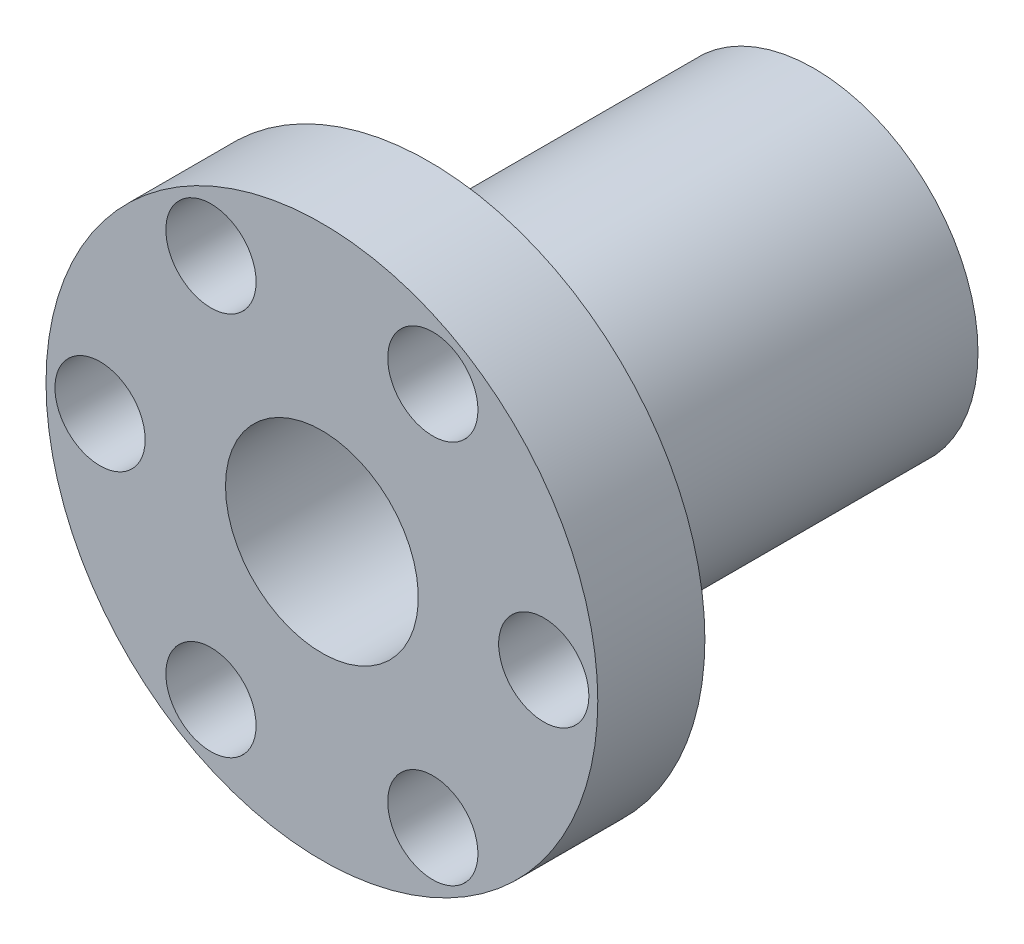
ISO-10303-21;
HEADER;
FILE_DESCRIPTION(('STEP AP214'),'2;1');
FILE_NAME('part.step','',(''),(''),'','','');
FILE_SCHEMA(('AUTOMOTIVE_DESIGN { 1 0 10303 214 1 1 1 1 }'));
ENDSEC;
DATA;
#1=APPLICATION_CONTEXT('core data for automotive mechanical design processes');
#2=APPLICATION_PROTOCOL_DEFINITION('international standard','automotive_design',2000,#1);
#3=PRODUCT_CONTEXT('',#1,'mechanical');
#4=PRODUCT('Part','Part','',(#3));
#5=PRODUCT_RELATED_PRODUCT_CATEGORY('part','',(#4));
#6=PRODUCT_DEFINITION_FORMATION('','',#4);
#7=PRODUCT_DEFINITION_CONTEXT('part definition',#1,'design');
#8=PRODUCT_DEFINITION('design','',#6,#7);
#9=PRODUCT_DEFINITION_SHAPE('','',#8);
#10=(LENGTH_UNIT() NAMED_UNIT(*) SI_UNIT(.MILLI.,.METRE.));
#11=(NAMED_UNIT(*) PLANE_ANGLE_UNIT() SI_UNIT($,.RADIAN.));
#12=(NAMED_UNIT(*) SI_UNIT($,.STERADIAN.) SOLID_ANGLE_UNIT());
#13=UNCERTAINTY_MEASURE_WITH_UNIT(LENGTH_MEASURE(1.E-05),#10,'distance_accuracy_value','');
#14=(GEOMETRIC_REPRESENTATION_CONTEXT(3) GLOBAL_UNCERTAINTY_ASSIGNED_CONTEXT((#13)) GLOBAL_UNIT_ASSIGNED_CONTEXT((#10,
#11,#12)) REPRESENTATION_CONTEXT('',''));
#15=CARTESIAN_POINT('',(0.,0.,0.));
#16=DIRECTION('',(0.,0.,1.));
#17=DIRECTION('',(1.,0.,0.));
#18=AXIS2_PLACEMENT_3D('',#15,#16,#17);
#19=CARTESIAN_POINT('',(0.,0.,11.11));
#20=DIRECTION('',(0.,0.,1.));
#21=DIRECTION('',(1.,0.,0.));
#22=AXIS2_PLACEMENT_3D('',#19,#20,#21);
#23=PLANE('',#22);
#24=CARTESIAN_POINT('',(-11.5075,19.9315746680988,11.11));
#25=DIRECTION('',(0.,0.,1.));
#26=DIRECTION('',(1.,0.,0.));
#27=AXIS2_PLACEMENT_3D('',#24,#25,#26);
#28=CIRCLE('',#27,4.68);
#29=CARTESIAN_POINT('',(-6.82750000000001,19.9315746680988,11.11));
#30=VERTEX_POINT('',#29);
#31=EDGE_CURVE('E70',#30,#30,#28,.T.);
#32=ORIENTED_EDGE('',*,*,#31,.F.);
#33=EDGE_LOOP('',(#32));
#34=FACE_BOUND('',#33,.T.);
#35=CARTESIAN_POINT('',(-11.5075,-19.9315746680989,11.11));
#36=DIRECTION('',(0.,0.,1.));
#37=DIRECTION('',(1.,0.,0.));
#38=AXIS2_PLACEMENT_3D('',#35,#36,#37);
#39=CIRCLE('',#38,4.68);
#40=CARTESIAN_POINT('',(-6.82749999999999,-19.9315746680989,11.11));
#41=VERTEX_POINT('',#40);
#42=EDGE_CURVE('E62',#41,#41,#39,.T.);
#43=ORIENTED_EDGE('',*,*,#42,.F.);
#44=EDGE_LOOP('',(#43));
#45=FACE_BOUND('',#44,.T.);
#46=CARTESIAN_POINT('',(23.015,0.,11.11));
#47=DIRECTION('',(0.,0.,1.));
#48=DIRECTION('',(1.,0.,0.));
#49=AXIS2_PLACEMENT_3D('',#46,#47,#48);
#50=CIRCLE('',#49,4.68);
#51=CARTESIAN_POINT('',(27.695,0.,11.11));
#52=VERTEX_POINT('',#51);
#53=EDGE_CURVE('E52',#52,#52,#50,.T.);
#54=ORIENTED_EDGE('',*,*,#53,.F.);
#55=EDGE_LOOP('',(#54));
#56=FACE_BOUND('',#55,.T.);
#57=CARTESIAN_POINT('',(0.,0.,11.11));
#58=DIRECTION('',(0.,0.,-1.));
#59=DIRECTION('',(-1.,0.,0.));
#60=AXIS2_PLACEMENT_3D('',#57,#58,#59);
#61=CIRCLE('',#60,10.);
#62=CARTESIAN_POINT('',(-10.,0.,11.11));
#63=VERTEX_POINT('',#62);
#64=EDGE_CURVE('E118',#63,#63,#61,.T.);
#65=ORIENTED_EDGE('',*,*,#64,.T.);
#66=EDGE_LOOP('',(#65));
#67=FACE_BOUND('',#66,.T.);
#68=CARTESIAN_POINT('',(0.,0.,11.11));
#69=DIRECTION('',(0.,0.,1.));
#70=DIRECTION('',(1.,0.,0.));
#71=AXIS2_PLACEMENT_3D('',#68,#69,#70);
#72=CIRCLE('',#71,28.62);
#73=CARTESIAN_POINT('',(28.62,0.,11.11));
#74=VERTEX_POINT('',#73);
#75=EDGE_CURVE('E39',#74,#74,#72,.T.);
#76=ORIENTED_EDGE('',*,*,#75,.T.);
#77=EDGE_LOOP('',(#76));
#78=FACE_BOUND('',#77,.T.);
#79=CARTESIAN_POINT('',(11.5075,-19.9315746680989,11.11));
#80=DIRECTION('',(0.,0.,1.));
#81=DIRECTION('',(1.,0.,0.));
#82=AXIS2_PLACEMENT_3D('',#79,#80,#81);
#83=CIRCLE('',#82,4.68);
#84=CARTESIAN_POINT('',(16.1875,-19.9315746680989,11.11));
#85=VERTEX_POINT('',#84);
#86=EDGE_CURVE('E57',#85,#85,#83,.T.);
#87=ORIENTED_EDGE('',*,*,#86,.F.);
#88=EDGE_LOOP('',(#87));
#89=FACE_BOUND('',#88,.T.);
#90=CARTESIAN_POINT('',(-23.015,0.,11.11));
#91=DIRECTION('',(0.,0.,1.));
#92=DIRECTION('',(1.,0.,0.));
#93=AXIS2_PLACEMENT_3D('',#90,#91,#92);
#94=CIRCLE('',#93,4.68);
#95=CARTESIAN_POINT('',(-18.335,0.,11.11));
#96=VERTEX_POINT('',#95);
#97=EDGE_CURVE('E66',#96,#96,#94,.T.);
#98=ORIENTED_EDGE('',*,*,#97,.F.);
#99=EDGE_LOOP('',(#98));
#100=FACE_BOUND('',#99,.T.);
#101=CARTESIAN_POINT('',(11.5075,19.9315746680989,11.11));
#102=DIRECTION('',(0.,0.,1.));
#103=DIRECTION('',(1.,0.,0.));
#104=AXIS2_PLACEMENT_3D('',#101,#102,#103);
#105=CIRCLE('',#104,4.68);
#106=CARTESIAN_POINT('',(16.1875,19.9315746680989,11.11));
#107=VERTEX_POINT('',#106);
#108=EDGE_CURVE('E238',#107,#107,#105,.T.);
#109=ORIENTED_EDGE('',*,*,#108,.F.);
#110=EDGE_LOOP('',(#109));
#111=FACE_BOUND('',#110,.T.);
#112=ADVANCED_FACE('F31',(#34,#45,#56,#67,#78,#89,#100,#111),#23,.T.);
#113=CARTESIAN_POINT('',(11.5075000000002,19.9315746680987,-7.77817459305202));
#114=DIRECTION('',(0.,0.,1.));
#115=DIRECTION('',(1.,0.,0.));
#116=AXIS2_PLACEMENT_3D('',#113,#114,#115);
#117=CYLINDRICAL_SURFACE('',#116,2.75);
#118=CARTESIAN_POINT('',(11.5075000000002,19.9315746680987,0.));
#119=DIRECTION('',(0.,0.,1.));
#120=DIRECTION('',(1.,0.,0.));
#121=AXIS2_PLACEMENT_3D('',#118,#119,#120);
#122=CIRCLE('',#121,2.75);
#123=CARTESIAN_POINT('',(14.2575000000002,19.9315746680987,0.));
#124=VERTEX_POINT('',#123);
#125=EDGE_CURVE('E51',#124,#124,#122,.F.);
#126=ORIENTED_EDGE('',*,*,#125,.T.);
#127=EDGE_LOOP('',(#126));
#128=FACE_BOUND('',#127,.T.);
#129=CARTESIAN_POINT('',(11.5075000000002,19.9315746680987,4.39));
#130=DIRECTION('',(0.,0.,1.));
#131=DIRECTION('',(1.,0.,0.));
#132=AXIS2_PLACEMENT_3D('',#129,#130,#131);
#133=CIRCLE('',#132,2.75);
#134=CARTESIAN_POINT('',(14.2575000000002,19.9315746680987,4.39));
#135=VERTEX_POINT('',#134);
#136=EDGE_CURVE('E35',#135,#135,#133,.F.);
#137=ORIENTED_EDGE('',*,*,#136,.F.);
#138=EDGE_LOOP('',(#137));
#139=FACE_BOUND('',#138,.T.);
#140=ADVANCED_FACE('F149',(#128,#139),#117,.F.);
#141=CARTESIAN_POINT('',(-11.5074999999998,19.931574668099,-7.77817459305202));
#142=DIRECTION('',(0.,0.,1.));
#143=DIRECTION('',(1.,0.,0.));
#144=AXIS2_PLACEMENT_3D('',#141,#142,#143);
#145=CYLINDRICAL_SURFACE('',#144,2.75);
#146=CARTESIAN_POINT('',(-11.5074999999998,19.931574668099,0.));
#147=DIRECTION('',(0.,0.,1.));
#148=DIRECTION('',(1.,0.,0.));
#149=AXIS2_PLACEMENT_3D('',#146,#147,#148);
#150=CIRCLE('',#149,2.75);
#151=CARTESIAN_POINT('',(-8.75749999999982,19.931574668099,0.));
#152=VERTEX_POINT('',#151);
#153=EDGE_CURVE('E102',#152,#152,#150,.F.);
#154=ORIENTED_EDGE('',*,*,#153,.T.);
#155=EDGE_LOOP('',(#154));
#156=FACE_BOUND('',#155,.T.);
#157=CARTESIAN_POINT('',(-11.5074999999998,19.931574668099,4.39));
#158=DIRECTION('',(0.,0.,1.));
#159=DIRECTION('',(1.,0.,0.));
#160=AXIS2_PLACEMENT_3D('',#157,#158,#159);
#161=CIRCLE('',#160,2.75);
#162=CARTESIAN_POINT('',(-8.75749999999982,19.931574668099,4.39));
#163=VERTEX_POINT('',#162);
#164=EDGE_CURVE('E67',#163,#163,#161,.F.);
#165=ORIENTED_EDGE('',*,*,#164,.F.);
#166=EDGE_LOOP('',(#165));
#167=FACE_BOUND('',#166,.T.);
#168=ADVANCED_FACE('F154',(#156,#167),#145,.F.);
#169=CARTESIAN_POINT('',(-23.015,1.60712886026949E-13,-7.77817459305202));
#170=DIRECTION('',(0.,0.,1.));
#171=DIRECTION('',(1.,0.,0.));
#172=AXIS2_PLACEMENT_3D('',#169,#170,#171);
#173=CYLINDRICAL_SURFACE('',#172,2.75);
#174=CARTESIAN_POINT('',(-23.015,1.60712886026949E-13,0.));
#175=DIRECTION('',(0.,0.,1.));
#176=DIRECTION('',(1.,0.,0.));
#177=AXIS2_PLACEMENT_3D('',#174,#175,#176);
#178=CIRCLE('',#177,2.75);
#179=CARTESIAN_POINT('',(-20.265,1.60712886026949E-13,0.));
#180=VERTEX_POINT('',#179);
#181=EDGE_CURVE('E105',#180,#180,#178,.F.);
#182=ORIENTED_EDGE('',*,*,#181,.T.);
#183=EDGE_LOOP('',(#182));
#184=FACE_BOUND('',#183,.T.);
#185=CARTESIAN_POINT('',(-23.015,1.60712886026949E-13,4.39));
#186=DIRECTION('',(0.,0.,1.));
#187=DIRECTION('',(1.,0.,0.));
#188=AXIS2_PLACEMENT_3D('',#185,#186,#187);
#189=CIRCLE('',#188,2.75);
#190=CARTESIAN_POINT('',(-20.265,1.60712886026949E-13,4.39));
#191=VERTEX_POINT('',#190);
#192=EDGE_CURVE('E63',#191,#191,#189,.F.);
#193=ORIENTED_EDGE('',*,*,#192,.F.);
#194=EDGE_LOOP('',(#193));
#195=FACE_BOUND('',#194,.T.);
#196=ADVANCED_FACE('F177',(#184,#195),#173,.F.);
#197=CARTESIAN_POINT('',(-11.5075000000001,-19.9315746680988,-7.77817459305202));
#198=DIRECTION('',(0.,0.,1.));
#199=DIRECTION('',(1.,0.,0.));
#200=AXIS2_PLACEMENT_3D('',#197,#198,#199);
#201=CYLINDRICAL_SURFACE('',#200,2.75);
#202=CARTESIAN_POINT('',(-11.5075000000001,-19.9315746680988,0.));
#203=DIRECTION('',(0.,0.,1.));
#204=DIRECTION('',(1.,0.,0.));
#205=AXIS2_PLACEMENT_3D('',#202,#203,#204);
#206=CIRCLE('',#205,2.75);
#207=CARTESIAN_POINT('',(-8.75750000000009,-19.9315746680988,0.));
#208=VERTEX_POINT('',#207);
#209=EDGE_CURVE('E108',#208,#208,#206,.F.);
#210=ORIENTED_EDGE('',*,*,#209,.T.);
#211=EDGE_LOOP('',(#210));
#212=FACE_BOUND('',#211,.T.);
#213=CARTESIAN_POINT('',(-11.5075000000001,-19.9315746680988,4.39));
#214=DIRECTION('',(0.,0.,1.));
#215=DIRECTION('',(1.,0.,0.));
#216=AXIS2_PLACEMENT_3D('',#213,#214,#215);
#217=CIRCLE('',#216,2.75);
#218=CARTESIAN_POINT('',(-8.75750000000009,-19.9315746680988,4.39));
#219=VERTEX_POINT('',#218);
#220=EDGE_CURVE('E58',#219,#219,#217,.F.);
#221=ORIENTED_EDGE('',*,*,#220,.F.);
#222=EDGE_LOOP('',(#221));
#223=FACE_BOUND('',#222,.T.);
#224=ADVANCED_FACE('F173',(#212,#223),#201,.F.);
#225=CARTESIAN_POINT('',(11.5075,-19.9315746680989,-7.77817459305202));
#226=DIRECTION('',(0.,0.,1.));
#227=DIRECTION('',(1.,0.,0.));
#228=AXIS2_PLACEMENT_3D('',#225,#226,#227);
#229=CYLINDRICAL_SURFACE('',#228,2.75);
#230=CARTESIAN_POINT('',(11.5075,-19.9315746680989,0.));
#231=DIRECTION('',(0.,0.,1.));
#232=DIRECTION('',(1.,0.,0.));
#233=AXIS2_PLACEMENT_3D('',#230,#231,#232);
#234=CIRCLE('',#233,2.75);
#235=CARTESIAN_POINT('',(14.2575,-19.9315746680989,0.));
#236=VERTEX_POINT('',#235);
#237=EDGE_CURVE('E111',#236,#236,#234,.F.);
#238=ORIENTED_EDGE('',*,*,#237,.T.);
#239=EDGE_LOOP('',(#238));
#240=FACE_BOUND('',#239,.T.);
#241=CARTESIAN_POINT('',(11.5075,-19.9315746680989,4.39));
#242=DIRECTION('',(0.,0.,1.));
#243=DIRECTION('',(1.,0.,0.));
#244=AXIS2_PLACEMENT_3D('',#241,#242,#243);
#245=CIRCLE('',#244,2.75);
#246=CARTESIAN_POINT('',(14.2575,-19.9315746680989,4.39));
#247=VERTEX_POINT('',#246);
#248=EDGE_CURVE('E53',#247,#247,#245,.F.);
#249=ORIENTED_EDGE('',*,*,#248,.F.);
#250=EDGE_LOOP('',(#249));
#251=FACE_BOUND('',#250,.T.);
#252=ADVANCED_FACE('F142',(#240,#251),#229,.F.);
#253=CARTESIAN_POINT('',(23.015,0.,-7.77817459305202));
#254=DIRECTION('',(0.,0.,1.));
#255=DIRECTION('',(1.,0.,0.));
#256=AXIS2_PLACEMENT_3D('',#253,#254,#255);
#257=CYLINDRICAL_SURFACE('',#256,2.75);
#258=CARTESIAN_POINT('',(23.015,0.,0.));
#259=DIRECTION('',(0.,0.,1.));
#260=DIRECTION('',(1.,0.,0.));
#261=AXIS2_PLACEMENT_3D('',#258,#259,#260);
#262=CIRCLE('',#261,2.75);
#263=CARTESIAN_POINT('',(25.765,0.,0.));
#264=VERTEX_POINT('',#263);
#265=EDGE_CURVE('E114',#264,#264,#262,.F.);
#266=ORIENTED_EDGE('',*,*,#265,.T.);
#267=EDGE_LOOP('',(#266));
#268=FACE_BOUND('',#267,.T.);
#269=CARTESIAN_POINT('',(23.015,0.,4.39));
#270=DIRECTION('',(0.,0.,1.));
#271=DIRECTION('',(1.,0.,0.));
#272=AXIS2_PLACEMENT_3D('',#269,#270,#271);
#273=CIRCLE('',#272,2.75);
#274=CARTESIAN_POINT('',(25.765,0.,4.39));
#275=VERTEX_POINT('',#274);
#276=EDGE_CURVE('E48',#275,#275,#273,.F.);
#277=ORIENTED_EDGE('',*,*,#276,.F.);
#278=EDGE_LOOP('',(#277));
#279=FACE_BOUND('',#278,.T.);
#280=ADVANCED_FACE('F134',(#268,#279),#257,.F.);
#281=CARTESIAN_POINT('',(0.,0.,0.));
#282=DIRECTION('',(0.,0.,1.));
#283=DIRECTION('',(1.,0.,0.));
#284=AXIS2_PLACEMENT_3D('',#281,#282,#283);
#285=PLANE('',#284);
#286=ORIENTED_EDGE('',*,*,#125,.F.);
#287=EDGE_LOOP('',(#286));
#288=FACE_BOUND('',#287,.T.);
#289=ORIENTED_EDGE('',*,*,#153,.F.);
#290=EDGE_LOOP('',(#289));
#291=FACE_BOUND('',#290,.T.);
#292=ORIENTED_EDGE('',*,*,#181,.F.);
#293=EDGE_LOOP('',(#292));
#294=FACE_BOUND('',#293,.T.);
#295=ORIENTED_EDGE('',*,*,#209,.F.);
#296=EDGE_LOOP('',(#295));
#297=FACE_BOUND('',#296,.T.);
#298=ORIENTED_EDGE('',*,*,#237,.F.);
#299=EDGE_LOOP('',(#298));
#300=FACE_BOUND('',#299,.T.);
#301=ORIENTED_EDGE('',*,*,#265,.F.);
#302=EDGE_LOOP('',(#301));
#303=FACE_BOUND('',#302,.T.);
#304=CARTESIAN_POINT('',(0.,0.,0.));
#305=DIRECTION('',(0.,0.,1.));
#306=DIRECTION('',(1.,0.,0.));
#307=AXIS2_PLACEMENT_3D('',#304,#305,#306);
#308=CIRCLE('',#307,28.62);
#309=CARTESIAN_POINT('',(28.62,0.,0.));
#310=VERTEX_POINT('',#309);
#311=EDGE_CURVE('E44',#310,#310,#308,.T.);
#312=ORIENTED_EDGE('',*,*,#311,.F.);
#313=EDGE_LOOP('',(#312));
#314=FACE_BOUND('',#313,.T.);
#315=CARTESIAN_POINT('',(0.,0.,0.));
#316=DIRECTION('',(0.,0.,1.));
#317=DIRECTION('',(1.,0.,0.));
#318=AXIS2_PLACEMENT_3D('',#315,#316,#317);
#319=CIRCLE('',#318,17.);
#320=CARTESIAN_POINT('',(17.,0.,0.));
#321=VERTEX_POINT('',#320);
#322=EDGE_CURVE('E10',#321,#321,#319,.F.);
#323=ORIENTED_EDGE('',*,*,#322,.F.);
#324=EDGE_LOOP('',(#323));
#325=FACE_BOUND('',#324,.T.);
#326=ADVANCED_FACE('F131',(#288,#291,#294,#297,#300,#303,#314,#325),#285,.F.);
#327=CARTESIAN_POINT('',(0.,0.,11.11));
#328=DIRECTION('',(0.,0.,-1.));
#329=DIRECTION('',(-1.,0.,0.));
#330=AXIS2_PLACEMENT_3D('',#327,#328,#329);
#331=CYLINDRICAL_SURFACE('',#330,28.62);
#332=ORIENTED_EDGE('',*,*,#75,.F.);
#333=EDGE_LOOP('',(#332));
#334=FACE_BOUND('',#333,.T.);
#335=ORIENTED_EDGE('',*,*,#311,.T.);
#336=EDGE_LOOP('',(#335));
#337=FACE_BOUND('',#336,.T.);
#338=ADVANCED_FACE('F33',(#334,#337),#331,.T.);
#339=CARTESIAN_POINT('',(0.,0.,-39.95));
#340=DIRECTION('',(0.,0.,1.));
#341=DIRECTION('',(1.,0.,0.));
#342=AXIS2_PLACEMENT_3D('',#339,#340,#341);
#343=CYLINDRICAL_SURFACE('',#342,17.);
#344=CARTESIAN_POINT('',(0.,0.,-39.95));
#345=DIRECTION('',(0.,0.,-1.));
#346=DIRECTION('',(-1.,0.,0.));
#347=AXIS2_PLACEMENT_3D('',#344,#345,#346);
#348=CIRCLE('',#347,17.);
#349=CARTESIAN_POINT('',(-17.,0.,-39.95));
#350=VERTEX_POINT('',#349);
#351=EDGE_CURVE('E121',#350,#350,#348,.T.);
#352=ORIENTED_EDGE('',*,*,#351,.F.);
#353=EDGE_LOOP('',(#352));
#354=FACE_BOUND('',#353,.T.);
#355=ORIENTED_EDGE('',*,*,#322,.T.);
#356=EDGE_LOOP('',(#355));
#357=FACE_BOUND('',#356,.T.);
#358=ADVANCED_FACE('F140',(#354,#357),#343,.T.);
#359=CARTESIAN_POINT('',(0.,0.,-39.95));
#360=DIRECTION('',(0.,0.,-1.));
#361=DIRECTION('',(-1.,0.,0.));
#362=AXIS2_PLACEMENT_3D('',#359,#360,#361);
#363=PLANE('',#362);
#364=CARTESIAN_POINT('',(0.,0.,-39.95));
#365=DIRECTION('',(0.,0.,-1.));
#366=DIRECTION('',(-1.,0.,0.));
#367=AXIS2_PLACEMENT_3D('',#364,#365,#366);
#368=CIRCLE('',#367,10.);
#369=CARTESIAN_POINT('',(-10.,0.,-39.95));
#370=VERTEX_POINT('',#369);
#371=EDGE_CURVE('E117',#370,#370,#368,.T.);
#372=ORIENTED_EDGE('',*,*,#371,.F.);
#373=EDGE_LOOP('',(#372));
#374=FACE_BOUND('',#373,.T.);
#375=ORIENTED_EDGE('',*,*,#351,.T.);
#376=EDGE_LOOP('',(#375));
#377=FACE_BOUND('',#376,.T.);
#378=ADVANCED_FACE('F161',(#374,#377),#363,.T.);
#379=CARTESIAN_POINT('',(0.,0.,11.11));
#380=DIRECTION('',(0.,0.,-1.));
#381=DIRECTION('',(-1.,0.,0.));
#382=AXIS2_PLACEMENT_3D('',#379,#380,#381);
#383=CYLINDRICAL_SURFACE('',#382,10.);
#384=ORIENTED_EDGE('',*,*,#64,.F.);
#385=EDGE_LOOP('',(#384));
#386=FACE_BOUND('',#385,.T.);
#387=ORIENTED_EDGE('',*,*,#371,.T.);
#388=EDGE_LOOP('',(#387));
#389=FACE_BOUND('',#388,.T.);
#390=ADVANCED_FACE('F165',(#386,#389),#383,.F.);
#391=CARTESIAN_POINT('',(23.015,0.,4.39));
#392=DIRECTION('',(0.,0.,1.));
#393=DIRECTION('',(1.,0.,0.));
#394=AXIS2_PLACEMENT_3D('',#391,#392,#393);
#395=PLANE('',#394);
#396=CARTESIAN_POINT('',(23.015,0.,4.39));
#397=DIRECTION('',(0.,0.,1.));
#398=DIRECTION('',(1.,0.,0.));
#399=AXIS2_PLACEMENT_3D('',#396,#397,#398);
#400=CIRCLE('',#399,4.68);
#401=CARTESIAN_POINT('',(27.695,0.,4.39));
#402=VERTEX_POINT('',#401);
#403=EDGE_CURVE('E56',#402,#402,#400,.T.);
#404=ORIENTED_EDGE('',*,*,#403,.T.);
#405=EDGE_LOOP('',(#404));
#406=FACE_BOUND('',#405,.T.);
#407=ORIENTED_EDGE('',*,*,#276,.T.);
#408=EDGE_LOOP('',(#407));
#409=FACE_BOUND('',#408,.T.);
#410=ADVANCED_FACE('F168',(#406,#409),#395,.T.);
#411=CARTESIAN_POINT('',(23.015,0.,11.11));
#412=DIRECTION('',(0.,0.,-1.));
#413=DIRECTION('',(-1.,0.,0.));
#414=AXIS2_PLACEMENT_3D('',#411,#412,#413);
#415=CYLINDRICAL_SURFACE('',#414,4.68);
#416=ORIENTED_EDGE('',*,*,#53,.T.);
#417=EDGE_LOOP('',(#416));
#418=FACE_BOUND('',#417,.T.);
#419=ORIENTED_EDGE('',*,*,#403,.F.);
#420=EDGE_LOOP('',(#419));
#421=FACE_BOUND('',#420,.T.);
#422=ADVANCED_FACE('F185',(#418,#421),#415,.F.);
#423=CARTESIAN_POINT('',(11.5075,-19.9315746680989,4.39));
#424=DIRECTION('',(0.,0.,1.));
#425=DIRECTION('',(1.,0.,0.));
#426=AXIS2_PLACEMENT_3D('',#423,#424,#425);
#427=PLANE('',#426);
#428=CARTESIAN_POINT('',(11.5075,-19.9315746680989,4.39));
#429=DIRECTION('',(0.,0.,1.));
#430=DIRECTION('',(1.,0.,0.));
#431=AXIS2_PLACEMENT_3D('',#428,#429,#430);
#432=CIRCLE('',#431,4.68);
#433=CARTESIAN_POINT('',(16.1875,-19.9315746680989,4.39));
#434=VERTEX_POINT('',#433);
#435=EDGE_CURVE('E61',#434,#434,#432,.T.);
#436=ORIENTED_EDGE('',*,*,#435,.T.);
#437=EDGE_LOOP('',(#436));
#438=FACE_BOUND('',#437,.T.);
#439=ORIENTED_EDGE('',*,*,#248,.T.);
#440=EDGE_LOOP('',(#439));
#441=FACE_BOUND('',#440,.T.);
#442=ADVANCED_FACE('F188',(#438,#441),#427,.T.);
#443=CARTESIAN_POINT('',(11.5075,-19.9315746680989,11.11));
#444=DIRECTION('',(0.,0.,-1.));
#445=DIRECTION('',(-1.,0.,0.));
#446=AXIS2_PLACEMENT_3D('',#443,#444,#445);
#447=CYLINDRICAL_SURFACE('',#446,4.68);
#448=ORIENTED_EDGE('',*,*,#86,.T.);
#449=EDGE_LOOP('',(#448));
#450=FACE_BOUND('',#449,.T.);
#451=ORIENTED_EDGE('',*,*,#435,.F.);
#452=EDGE_LOOP('',(#451));
#453=FACE_BOUND('',#452,.T.);
#454=ADVANCED_FACE('F193',(#450,#453),#447,.F.);
#455=CARTESIAN_POINT('',(-11.5075,-19.9315746680989,4.39));
#456=DIRECTION('',(0.,0.,1.));
#457=DIRECTION('',(1.,0.,0.));
#458=AXIS2_PLACEMENT_3D('',#455,#456,#457);
#459=PLANE('',#458);
#460=CARTESIAN_POINT('',(-11.5075,-19.9315746680989,4.39));
#461=DIRECTION('',(0.,0.,1.));
#462=DIRECTION('',(1.,0.,0.));
#463=AXIS2_PLACEMENT_3D('',#460,#461,#462);
#464=CIRCLE('',#463,4.68);
#465=CARTESIAN_POINT('',(-6.82749999999999,-19.9315746680989,4.39));
#466=VERTEX_POINT('',#465);
#467=EDGE_CURVE('E65',#466,#466,#464,.T.);
#468=ORIENTED_EDGE('',*,*,#467,.T.);
#469=EDGE_LOOP('',(#468));
#470=FACE_BOUND('',#469,.T.);
#471=ORIENTED_EDGE('',*,*,#220,.T.);
#472=EDGE_LOOP('',(#471));
#473=FACE_BOUND('',#472,.T.);
#474=ADVANCED_FACE('F196',(#470,#473),#459,.T.);
#475=CARTESIAN_POINT('',(-11.5075,-19.9315746680989,11.11));
#476=DIRECTION('',(0.,0.,-1.));
#477=DIRECTION('',(-1.,0.,0.));
#478=AXIS2_PLACEMENT_3D('',#475,#476,#477);
#479=CYLINDRICAL_SURFACE('',#478,4.68);
#480=ORIENTED_EDGE('',*,*,#42,.T.);
#481=EDGE_LOOP('',(#480));
#482=FACE_BOUND('',#481,.T.);
#483=ORIENTED_EDGE('',*,*,#467,.F.);
#484=EDGE_LOOP('',(#483));
#485=FACE_BOUND('',#484,.T.);
#486=ADVANCED_FACE('F201',(#482,#485),#479,.F.);
#487=CARTESIAN_POINT('',(-23.015,0.,4.39));
#488=DIRECTION('',(0.,0.,1.));
#489=DIRECTION('',(1.,0.,0.));
#490=AXIS2_PLACEMENT_3D('',#487,#488,#489);
#491=PLANE('',#490);
#492=CARTESIAN_POINT('',(-23.015,0.,4.39));
#493=DIRECTION('',(0.,0.,1.));
#494=DIRECTION('',(1.,0.,0.));
#495=AXIS2_PLACEMENT_3D('',#492,#493,#494);
#496=CIRCLE('',#495,4.68);
#497=CARTESIAN_POINT('',(-18.335,0.,4.39));
#498=VERTEX_POINT('',#497);
#499=EDGE_CURVE('E69',#498,#498,#496,.T.);
#500=ORIENTED_EDGE('',*,*,#499,.T.);
#501=EDGE_LOOP('',(#500));
#502=FACE_BOUND('',#501,.T.);
#503=ORIENTED_EDGE('',*,*,#192,.T.);
#504=EDGE_LOOP('',(#503));
#505=FACE_BOUND('',#504,.T.);
#506=ADVANCED_FACE('F204',(#502,#505),#491,.T.);
#507=CARTESIAN_POINT('',(-23.015,0.,11.11));
#508=DIRECTION('',(0.,0.,-1.));
#509=DIRECTION('',(-1.,0.,0.));
#510=AXIS2_PLACEMENT_3D('',#507,#508,#509);
#511=CYLINDRICAL_SURFACE('',#510,4.68);
#512=ORIENTED_EDGE('',*,*,#97,.T.);
#513=EDGE_LOOP('',(#512));
#514=FACE_BOUND('',#513,.T.);
#515=ORIENTED_EDGE('',*,*,#499,.F.);
#516=EDGE_LOOP('',(#515));
#517=FACE_BOUND('',#516,.T.);
#518=ADVANCED_FACE('F209',(#514,#517),#511,.F.);
#519=CARTESIAN_POINT('',(-11.5075,19.9315746680988,4.39));
#520=DIRECTION('',(0.,0.,1.));
#521=DIRECTION('',(1.,0.,0.));
#522=AXIS2_PLACEMENT_3D('',#519,#520,#521);
#523=PLANE('',#522);
#524=CARTESIAN_POINT('',(-11.5075,19.9315746680988,4.39));
#525=DIRECTION('',(0.,0.,1.));
#526=DIRECTION('',(1.,0.,0.));
#527=AXIS2_PLACEMENT_3D('',#524,#525,#526);
#528=CIRCLE('',#527,4.68);
#529=CARTESIAN_POINT('',(-6.82750000000001,19.9315746680988,4.39));
#530=VERTEX_POINT('',#529);
#531=EDGE_CURVE('E76',#530,#530,#528,.T.);
#532=ORIENTED_EDGE('',*,*,#531,.T.);
#533=EDGE_LOOP('',(#532));
#534=FACE_BOUND('',#533,.T.);
#535=ORIENTED_EDGE('',*,*,#164,.T.);
#536=EDGE_LOOP('',(#535));
#537=FACE_BOUND('',#536,.T.);
#538=ADVANCED_FACE('F212',(#534,#537),#523,.T.);
#539=CARTESIAN_POINT('',(-11.5075,19.9315746680988,11.11));
#540=DIRECTION('',(0.,0.,-1.));
#541=DIRECTION('',(-1.,0.,0.));
#542=AXIS2_PLACEMENT_3D('',#539,#540,#541);
#543=CYLINDRICAL_SURFACE('',#542,4.68);
#544=ORIENTED_EDGE('',*,*,#31,.T.);
#545=EDGE_LOOP('',(#544));
#546=FACE_BOUND('',#545,.T.);
#547=ORIENTED_EDGE('',*,*,#531,.F.);
#548=EDGE_LOOP('',(#547));
#549=FACE_BOUND('',#548,.T.);
#550=ADVANCED_FACE('F217',(#546,#549),#543,.F.);
#551=CARTESIAN_POINT('',(11.5075,19.9315746680989,4.39));
#552=DIRECTION('',(0.,0.,1.));
#553=DIRECTION('',(1.,0.,0.));
#554=AXIS2_PLACEMENT_3D('',#551,#552,#553);
#555=PLANE('',#554);
#556=CARTESIAN_POINT('',(11.5075,19.9315746680989,4.39));
#557=DIRECTION('',(0.,0.,1.));
#558=DIRECTION('',(1.,0.,0.));
#559=AXIS2_PLACEMENT_3D('',#556,#557,#558);
#560=CIRCLE('',#559,4.68);
#561=CARTESIAN_POINT('',(16.1875,19.9315746680989,4.39));
#562=VERTEX_POINT('',#561);
#563=EDGE_CURVE('E83',#562,#562,#560,.T.);
#564=ORIENTED_EDGE('',*,*,#563,.T.);
#565=EDGE_LOOP('',(#564));
#566=FACE_BOUND('',#565,.T.);
#567=ORIENTED_EDGE('',*,*,#136,.T.);
#568=EDGE_LOOP('',(#567));
#569=FACE_BOUND('',#568,.T.);
#570=ADVANCED_FACE('F220',(#566,#569),#555,.T.);
#571=CARTESIAN_POINT('',(11.5075,19.9315746680989,11.11));
#572=DIRECTION('',(0.,0.,-1.));
#573=DIRECTION('',(-1.,0.,0.));
#574=AXIS2_PLACEMENT_3D('',#571,#572,#573);
#575=CYLINDRICAL_SURFACE('',#574,4.68);
#576=ORIENTED_EDGE('',*,*,#108,.T.);
#577=EDGE_LOOP('',(#576));
#578=FACE_BOUND('',#577,.T.);
#579=ORIENTED_EDGE('',*,*,#563,.F.);
#580=EDGE_LOOP('',(#579));
#581=FACE_BOUND('',#580,.T.);
#582=ADVANCED_FACE('F224',(#578,#581),#575,.F.);
#583=CLOSED_SHELL('',(#112,#140,#168,#196,#224,#252,#280,#326,#338,#358,#378,#390,#410,#422,
#442,#454,#474,#486,#506,#518,#538,#550,#570,#582));
#584=MANIFOLD_SOLID_BREP('B2',#583);
#585=ADVANCED_BREP_SHAPE_REPRESENTATION('',(#18,#584),#14);
#586=SHAPE_DEFINITION_REPRESENTATION(#9,#585);
ENDSEC;
END-ISO-10303-21;
